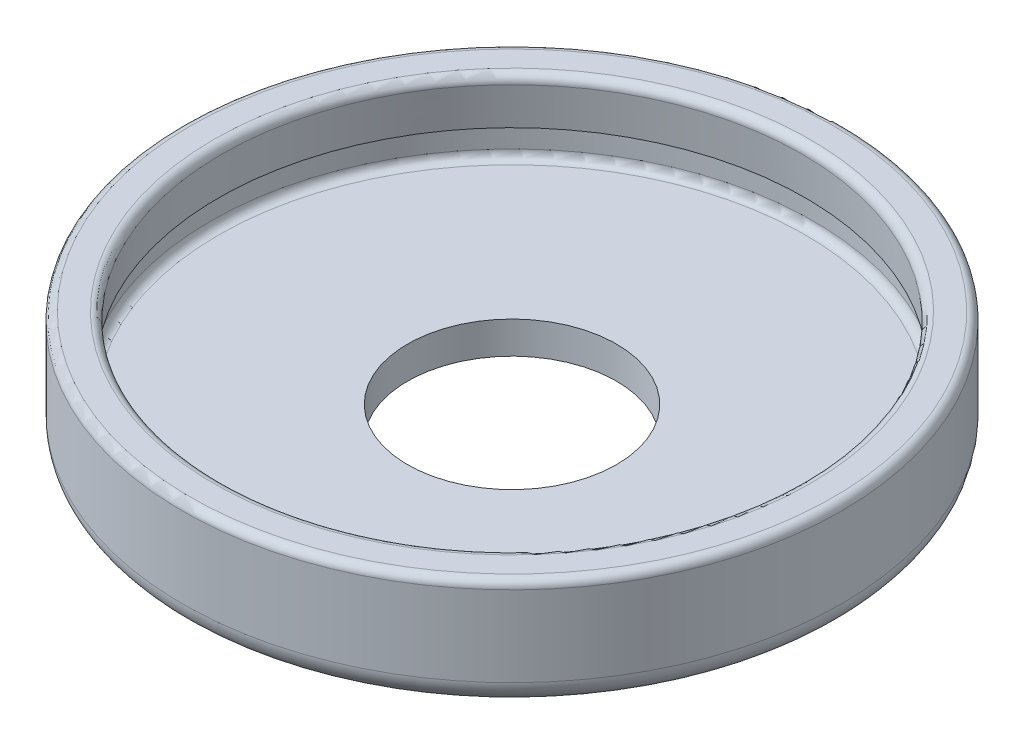
ISO-10303-21;
HEADER;
FILE_DESCRIPTION(('STEP AP214'),'2;1');
FILE_NAME('part.step','',(''),(''),'','','');
FILE_SCHEMA(('AUTOMOTIVE_DESIGN { 1 0 10303 214 1 1 1 1 }'));
ENDSEC;
DATA;
#1=APPLICATION_CONTEXT('core data for automotive mechanical design processes');
#2=APPLICATION_PROTOCOL_DEFINITION('international standard','automotive_design',2000,#1);
#3=PRODUCT_CONTEXT('',#1,'mechanical');
#4=PRODUCT('Part','Part','',(#3));
#5=PRODUCT_RELATED_PRODUCT_CATEGORY('part','',(#4));
#6=PRODUCT_DEFINITION_FORMATION('','',#4);
#7=PRODUCT_DEFINITION_CONTEXT('part definition',#1,'design');
#8=PRODUCT_DEFINITION('design','',#6,#7);
#9=PRODUCT_DEFINITION_SHAPE('','',#8);
#10=(LENGTH_UNIT() NAMED_UNIT(*) SI_UNIT(.MILLI.,.METRE.));
#11=(NAMED_UNIT(*) PLANE_ANGLE_UNIT() SI_UNIT($,.RADIAN.));
#12=(NAMED_UNIT(*) SI_UNIT($,.STERADIAN.) SOLID_ANGLE_UNIT());
#13=UNCERTAINTY_MEASURE_WITH_UNIT(LENGTH_MEASURE(1.E-05),#10,'distance_accuracy_value','');
#14=(GEOMETRIC_REPRESENTATION_CONTEXT(3) GLOBAL_UNCERTAINTY_ASSIGNED_CONTEXT((#13)) GLOBAL_UNIT_ASSIGNED_CONTEXT((#10,
#11,#12)) REPRESENTATION_CONTEXT('',''));
#15=CARTESIAN_POINT('',(0.,0.,0.));
#16=DIRECTION('',(0.,0.,1.));
#17=DIRECTION('',(1.,0.,0.));
#18=AXIS2_PLACEMENT_3D('',#15,#16,#17);
#19=CARTESIAN_POINT('',(0.,1.01599999999278,0.));
#20=DIRECTION('',(0.,-1.,0.));
#21=DIRECTION('',(1.,0.,0.));
#22=AXIS2_PLACEMENT_3D('',#19,#20,#21);
#23=CONICAL_SURFACE('',#22,4.63549999999913,0.0831412318884371);
#24=CARTESIAN_POINT('',(0.,1.01599999999278,0.));
#25=DIRECTION('',(0.,-1.,0.));
#26=DIRECTION('',(1.,0.,0.));
#27=AXIS2_PLACEMENT_3D('',#24,#25,#26);
#28=CIRCLE('',#27,4.63549999999913);
#29=CARTESIAN_POINT('',(4.63549999999913,1.0159999999928,0.));
#30=VERTEX_POINT('',#29);
#31=EDGE_CURVE('E18',#30,#30,#28,.F.);
#32=ORIENTED_EDGE('',*,*,#31,.F.);
#33=EDGE_LOOP('',(#32));
#34=FACE_BOUND('',#33,.T.);
#35=CARTESIAN_POINT('',(0.,1.64045322405856,0.));
#36=DIRECTION('',(0.,1.,0.));
#37=DIRECTION('',(-1.,0.,0.));
#38=AXIS2_PLACEMENT_3D('',#35,#36,#37);
#39=CIRCLE('',#38,4.58346223132846);
#40=CARTESIAN_POINT('',(-4.58346223132846,1.64045322405855,0.));
#41=VERTEX_POINT('',#40);
#42=EDGE_CURVE('E48',#41,#41,#39,.F.);
#43=ORIENTED_EDGE('',*,*,#42,.F.);
#44=EDGE_LOOP('',(#43));
#45=FACE_BOUND('',#44,.T.);
#46=ADVANCED_FACE('F15',(#34,#45),#23,.F.);
#47=CARTESIAN_POINT('',(0.,1.65099999999998,0.));
#48=DIRECTION('',(0.,1.,0.));
#49=DIRECTION('',(-1.,0.,0.));
#50=AXIS2_PLACEMENT_3D('',#47,#48,#49);
#51=TOROIDAL_SURFACE('',#50,4.71002354262556,0.127);
#52=CARTESIAN_POINT('',(0.,1.77799999999998,0.));
#53=DIRECTION('',(0.,1.,0.));
#54=DIRECTION('',(-1.,0.,0.));
#55=AXIS2_PLACEMENT_3D('',#52,#53,#54);
#56=CIRCLE('',#55,4.71002354262556);
#57=CARTESIAN_POINT('',(-4.71002354262556,1.77799999999997,0.));
#58=VERTEX_POINT('',#57);
#59=EDGE_CURVE('E38',#58,#58,#56,.F.);
#60=ORIENTED_EDGE('',*,*,#59,.F.);
#61=EDGE_LOOP('',(#60));
#62=FACE_BOUND('',#61,.T.);
#63=ORIENTED_EDGE('',*,*,#42,.T.);
#64=EDGE_LOOP('',(#63));
#65=FACE_BOUND('',#64,.T.);
#66=ADVANCED_FACE('F61',(#62,#65),#51,.T.);
#67=CARTESIAN_POINT('',(0.,1.01599999999998,0.));
#68=DIRECTION('',(0.,-1.,0.));
#69=DIRECTION('',(1.,0.,0.));
#70=AXIS2_PLACEMENT_3D('',#67,#68,#69);
#71=PLANE('',#70);
#72=ORIENTED_EDGE('',*,*,#31,.T.);
#73=EDGE_LOOP('',(#72));
#74=FACE_BOUND('',#73,.T.);
#75=CARTESIAN_POINT('',(0.,1.01599999999998,0.));
#76=DIRECTION('',(0.,-1.,0.));
#77=DIRECTION('',(1.,0.,0.));
#78=AXIS2_PLACEMENT_3D('',#75,#76,#77);
#79=CIRCLE('',#78,4.7625);
#80=CARTESIAN_POINT('',(4.7625,1.016,0.));
#81=VERTEX_POINT('',#80);
#82=EDGE_CURVE('E35',#81,#81,#79,.T.);
#83=ORIENTED_EDGE('',*,*,#82,.T.);
#84=EDGE_LOOP('',(#83));
#85=FACE_BOUND('',#84,.T.);
#86=ADVANCED_FACE('F63',(#74,#85),#71,.T.);
#87=CARTESIAN_POINT('',(0.,1.77799999999998,0.));
#88=DIRECTION('',(0.,1.,0.));
#89=DIRECTION('',(-1.,0.,0.));
#90=AXIS2_PLACEMENT_3D('',#87,#88,#89);
#91=PLANE('',#90);
#92=ORIENTED_EDGE('',*,*,#59,.T.);
#93=EDGE_LOOP('',(#92));
#94=FACE_BOUND('',#93,.T.);
#95=CARTESIAN_POINT('',(0.,1.77799999999998,0.));
#96=DIRECTION('',(0.,-1.,0.));
#97=DIRECTION('',(-1.,0.,0.));
#98=AXIS2_PLACEMENT_3D('',#95,#96,#97);
#99=CIRCLE('',#98,5.08);
#100=CARTESIAN_POINT('',(-5.08000000000001,1.77799999999997,0.));
#101=VERTEX_POINT('',#100);
#102=EDGE_CURVE('E37',#101,#101,#99,.T.);
#103=ORIENTED_EDGE('',*,*,#102,.F.);
#104=EDGE_LOOP('',(#103));
#105=FACE_BOUND('',#104,.T.);
#106=ADVANCED_FACE('F69',(#94,#105),#91,.T.);
#107=CARTESIAN_POINT('',(0.,-1.55045337728563,0.));
#108=DIRECTION('',(0.,-1.,0.));
#109=DIRECTION('',(1.,0.,0.));
#110=AXIS2_PLACEMENT_3D('',#107,#108,#109);
#111=CYLINDRICAL_SURFACE('',#110,4.7625);
#112=ORIENTED_EDGE('',*,*,#82,.F.);
#113=EDGE_LOOP('',(#112));
#114=FACE_BOUND('',#113,.T.);
#115=CARTESIAN_POINT('',(0.,0.634999999999989,0.));
#116=DIRECTION('',(0.,1.,0.));
#117=DIRECTION('',(-1.,0.,0.));
#118=AXIS2_PLACEMENT_3D('',#115,#116,#117);
#119=CIRCLE('',#118,4.7625);
#120=CARTESIAN_POINT('',(-4.76250000000001,0.634999999999972,0.));
#121=VERTEX_POINT('',#120);
#122=EDGE_CURVE('E42',#121,#121,#119,.F.);
#123=ORIENTED_EDGE('',*,*,#122,.T.);
#124=EDGE_LOOP('',(#123));
#125=FACE_BOUND('',#124,.T.);
#126=ADVANCED_FACE('F175',(#114,#125),#111,.F.);
#127=CARTESIAN_POINT('',(0.,1.65099999999998,0.));
#128=DIRECTION('',(0.,1.,0.));
#129=DIRECTION('',(-1.,0.,0.));
#130=AXIS2_PLACEMENT_3D('',#127,#128,#129);
#131=TOROIDAL_SURFACE('',#130,5.08,0.127);
#132=CARTESIAN_POINT('',(0.,1.65099999999998,0.));
#133=DIRECTION('',(0.,-1.,0.));
#134=DIRECTION('',(1.,0.,0.));
#135=AXIS2_PLACEMENT_3D('',#132,#133,#134);
#136=CIRCLE('',#135,5.207);
#137=CARTESIAN_POINT('',(5.207,1.651,0.));
#138=VERTEX_POINT('',#137);
#139=EDGE_CURVE('E126',#138,#138,#136,.T.);
#140=ORIENTED_EDGE('',*,*,#139,.F.);
#141=EDGE_LOOP('',(#140));
#142=FACE_BOUND('',#141,.T.);
#143=ORIENTED_EDGE('',*,*,#102,.T.);
#144=EDGE_LOOP('',(#143));
#145=FACE_BOUND('',#144,.T.);
#146=ADVANCED_FACE('F145',(#142,#145),#131,.T.);
#147=CARTESIAN_POINT('',(0.,0.634999999999989,0.));
#148=DIRECTION('',(0.,1.,0.));
#149=DIRECTION('',(-1.,0.,0.));
#150=AXIS2_PLACEMENT_3D('',#147,#148,#149);
#151=TOROIDAL_SURFACE('',#150,4.6355,0.127);
#152=ORIENTED_EDGE('',*,*,#122,.F.);
#153=EDGE_LOOP('',(#152));
#154=FACE_BOUND('',#153,.T.);
#155=CARTESIAN_POINT('',(0.,0.507999999999989,0.));
#156=DIRECTION('',(0.,-1.,0.));
#157=DIRECTION('',(-1.,0.,0.));
#158=AXIS2_PLACEMENT_3D('',#155,#156,#157);
#159=CIRCLE('',#158,4.6355);
#160=CARTESIAN_POINT('',(-4.6355,0.507999999999972,0.));
#161=VERTEX_POINT('',#160);
#162=EDGE_CURVE('E122',#161,#161,#159,.F.);
#163=ORIENTED_EDGE('',*,*,#162,.F.);
#164=EDGE_LOOP('',(#163));
#165=FACE_BOUND('',#164,.T.);
#166=ADVANCED_FACE('F140',(#154,#165),#151,.F.);
#167=CARTESIAN_POINT('',(0.,-1.55045337728563,0.));
#168=DIRECTION('',(0.,-1.,0.));
#169=DIRECTION('',(1.,0.,0.));
#170=AXIS2_PLACEMENT_3D('',#167,#168,#169);
#171=CYLINDRICAL_SURFACE('',#170,5.207);
#172=CARTESIAN_POINT('',(0.,0.380999999999988,0.));
#173=DIRECTION('',(0.,1.,0.));
#174=DIRECTION('',(-1.,0.,0.));
#175=AXIS2_PLACEMENT_3D('',#172,#173,#174);
#176=CIRCLE('',#175,5.207);
#177=CARTESIAN_POINT('',(-5.20700000000001,0.38099999999997,0.));
#178=VERTEX_POINT('',#177);
#179=EDGE_CURVE('E34',#178,#178,#176,.F.);
#180=ORIENTED_EDGE('',*,*,#179,.F.);
#181=EDGE_LOOP('',(#180));
#182=FACE_BOUND('',#181,.T.);
#183=ORIENTED_EDGE('',*,*,#139,.T.);
#184=EDGE_LOOP('',(#183));
#185=FACE_BOUND('',#184,.T.);
#186=ADVANCED_FACE('F144',(#182,#185),#171,.T.);
#187=CARTESIAN_POINT('',(0.,0.507999999999989,0.));
#188=DIRECTION('',(0.,1.,0.));
#189=DIRECTION('',(-1.,0.,0.));
#190=AXIS2_PLACEMENT_3D('',#187,#188,#189);
#191=PLANE('',#190);
#192=CARTESIAN_POINT('',(0.,0.507999999999994,0.));
#193=DIRECTION('',(0.,-1.,0.));
#194=DIRECTION('',(1.,0.,0.));
#195=AXIS2_PLACEMENT_3D('',#192,#193,#194);
#196=CIRCLE('',#195,1.651);
#197=CARTESIAN_POINT('',(1.651,0.508,0.));
#198=VERTEX_POINT('',#197);
#199=EDGE_CURVE('E27',#198,#198,#196,.T.);
#200=ORIENTED_EDGE('',*,*,#199,.T.);
#201=EDGE_LOOP('',(#200));
#202=FACE_BOUND('',#201,.T.);
#203=ORIENTED_EDGE('',*,*,#162,.T.);
#204=EDGE_LOOP('',(#203));
#205=FACE_BOUND('',#204,.T.);
#206=ADVANCED_FACE('F104',(#202,#205),#191,.T.);
#207=CARTESIAN_POINT('',(0.,0.380999999999988,0.));
#208=DIRECTION('',(0.,1.,0.));
#209=DIRECTION('',(-1.,0.,0.));
#210=AXIS2_PLACEMENT_3D('',#207,#208,#209);
#211=TOROIDAL_SURFACE('',#210,4.826,0.381);
#212=CARTESIAN_POINT('',(0.,0.,0.));
#213=DIRECTION('',(0.,1.,0.));
#214=DIRECTION('',(-1.,0.,0.));
#215=AXIS2_PLACEMENT_3D('',#212,#213,#214);
#216=CIRCLE('',#215,4.826);
#217=CARTESIAN_POINT('',(-4.826,0.,0.));
#218=VERTEX_POINT('',#217);
#219=EDGE_CURVE('E22',#218,#218,#216,.T.);
#220=ORIENTED_EDGE('',*,*,#219,.T.);
#221=EDGE_LOOP('',(#220));
#222=FACE_BOUND('',#221,.T.);
#223=ORIENTED_EDGE('',*,*,#179,.T.);
#224=EDGE_LOOP('',(#223));
#225=FACE_BOUND('',#224,.T.);
#226=ADVANCED_FACE('F81',(#222,#225),#211,.T.);
#227=CARTESIAN_POINT('',(0.,-1.55045337728563,0.));
#228=DIRECTION('',(0.,-1.,0.));
#229=DIRECTION('',(1.,0.,0.));
#230=AXIS2_PLACEMENT_3D('',#227,#228,#229);
#231=CYLINDRICAL_SURFACE('',#230,1.651);
#232=ORIENTED_EDGE('',*,*,#199,.F.);
#233=EDGE_LOOP('',(#232));
#234=FACE_BOUND('',#233,.T.);
#235=CARTESIAN_POINT('',(0.,0.,0.));
#236=DIRECTION('',(0.,-1.,0.));
#237=DIRECTION('',(1.,0.,0.));
#238=AXIS2_PLACEMENT_3D('',#235,#236,#237);
#239=CIRCLE('',#238,1.651);
#240=CARTESIAN_POINT('',(1.651,0.,0.));
#241=VERTEX_POINT('',#240);
#242=EDGE_CURVE('E10',#241,#241,#239,.T.);
#243=ORIENTED_EDGE('',*,*,#242,.T.);
#244=EDGE_LOOP('',(#243));
#245=FACE_BOUND('',#244,.T.);
#246=ADVANCED_FACE('F75',(#234,#245),#231,.F.);
#247=CARTESIAN_POINT('',(0.,0.,0.));
#248=DIRECTION('',(0.,1.,0.));
#249=DIRECTION('',(-1.,0.,0.));
#250=AXIS2_PLACEMENT_3D('',#247,#248,#249);
#251=PLANE('',#250);
#252=ORIENTED_EDGE('',*,*,#242,.F.);
#253=EDGE_LOOP('',(#252));
#254=FACE_BOUND('',#253,.T.);
#255=ORIENTED_EDGE('',*,*,#219,.F.);
#256=EDGE_LOOP('',(#255));
#257=FACE_BOUND('',#256,.T.);
#258=ADVANCED_FACE('F73',(#254,#257),#251,.F.);
#259=CLOSED_SHELL('',(#46,#66,#86,#106,#126,#146,#166,#186,#206,#226,#246,#258));
#260=MANIFOLD_SOLID_BREP('B1',#259);
#261=ADVANCED_BREP_SHAPE_REPRESENTATION('',(#18,#260),#14);
#262=SHAPE_DEFINITION_REPRESENTATION(#9,#261);
ENDSEC;
END-ISO-10303-21;
